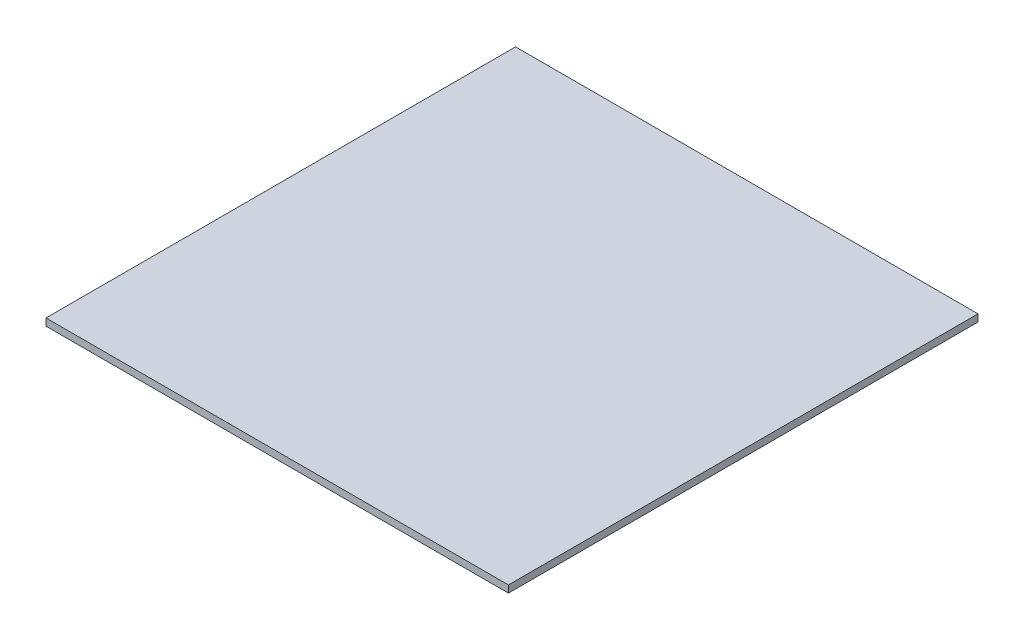
ISO-10303-21;
HEADER;
FILE_DESCRIPTION(('STEP AP214'),'2;1');
FILE_NAME('part.step','',(''),(''),'','','');
FILE_SCHEMA(('AUTOMOTIVE_DESIGN { 1 0 10303 214 1 1 1 1 }'));
ENDSEC;
DATA;
#1=APPLICATION_CONTEXT('core data for automotive mechanical design processes');
#2=APPLICATION_PROTOCOL_DEFINITION('international standard','automotive_design',2000,#1);
#3=PRODUCT_CONTEXT('',#1,'mechanical');
#4=PRODUCT('Part','Part','',(#3));
#5=PRODUCT_RELATED_PRODUCT_CATEGORY('part','',(#4));
#6=PRODUCT_DEFINITION_FORMATION('','',#4);
#7=PRODUCT_DEFINITION_CONTEXT('part definition',#1,'design');
#8=PRODUCT_DEFINITION('design','',#6,#7);
#9=PRODUCT_DEFINITION_SHAPE('','',#8);
#10=(LENGTH_UNIT() NAMED_UNIT(*) SI_UNIT(.MILLI.,.METRE.));
#11=(NAMED_UNIT(*) PLANE_ANGLE_UNIT() SI_UNIT($,.RADIAN.));
#12=(NAMED_UNIT(*) SI_UNIT($,.STERADIAN.) SOLID_ANGLE_UNIT());
#13=UNCERTAINTY_MEASURE_WITH_UNIT(LENGTH_MEASURE(1.E-05),#10,'distance_accuracy_value','');
#14=(GEOMETRIC_REPRESENTATION_CONTEXT(3) GLOBAL_UNCERTAINTY_ASSIGNED_CONTEXT((#13)) GLOBAL_UNIT_ASSIGNED_CONTEXT((#10,
#11,#12)) REPRESENTATION_CONTEXT('',''));
#15=CARTESIAN_POINT('',(0.,0.,0.));
#16=DIRECTION('',(0.,0.,1.));
#17=DIRECTION('',(1.,0.,0.));
#18=AXIS2_PLACEMENT_3D('',#15,#16,#17);
#19=CARTESIAN_POINT('',(103.1875,3.175,104.775));
#20=DIRECTION('',(-1.,0.,0.));
#21=DIRECTION('',(0.,0.,1.));
#22=AXIS2_PLACEMENT_3D('',#19,#20,#21);
#23=PLANE('',#22);
#24=DIRECTION('',(0.,0.,-1.));
#25=VECTOR('',#24,1.);
#26=CARTESIAN_POINT('',(103.1875,0.,104.775));
#27=LINE('',#26,#25);
#28=CARTESIAN_POINT('',(103.1875,0.,104.775));
#29=VERTEX_POINT('',#28);
#30=CARTESIAN_POINT('',(103.1875,0.,-104.775));
#31=VERTEX_POINT('',#30);
#32=EDGE_CURVE('E101',#29,#31,#27,.T.);
#33=ORIENTED_EDGE('',*,*,#32,.T.);
#34=DIRECTION('',(0.,-1.,0.));
#35=VECTOR('',#34,1.);
#36=CARTESIAN_POINT('',(103.1875,3.175,-104.775));
#37=LINE('',#36,#35);
#38=CARTESIAN_POINT('',(103.1875,3.175,-104.775));
#39=VERTEX_POINT('',#38);
#40=EDGE_CURVE('E11',#39,#31,#37,.T.);
#41=ORIENTED_EDGE('',*,*,#40,.F.);
#42=DIRECTION('',(0.,0.,-1.));
#43=VECTOR('',#42,1.);
#44=CARTESIAN_POINT('',(103.1875,3.175,104.775));
#45=LINE('',#44,#43);
#46=CARTESIAN_POINT('',(103.1875,3.175,104.775));
#47=VERTEX_POINT('',#46);
#48=EDGE_CURVE('E89',#47,#39,#45,.T.);
#49=ORIENTED_EDGE('',*,*,#48,.F.);
#50=DIRECTION('',(0.,-1.,0.));
#51=VECTOR('',#50,1.);
#52=CARTESIAN_POINT('',(103.1875,3.175,104.775));
#53=LINE('',#52,#51);
#54=EDGE_CURVE('E97',#47,#29,#53,.T.);
#55=ORIENTED_EDGE('',*,*,#54,.T.);
#56=EDGE_LOOP('',(#33,#41,#49,#55));
#57=FACE_BOUND('',#56,.T.);
#58=ADVANCED_FACE('F38',(#57),#23,.F.);
#59=CARTESIAN_POINT('',(-103.1875,3.175,-104.775));
#60=DIRECTION('',(0.,0.,1.));
#61=DIRECTION('',(1.,0.,0.));
#62=AXIS2_PLACEMENT_3D('',#59,#60,#61);
#63=PLANE('',#62);
#64=DIRECTION('',(-1.,0.,0.));
#65=VECTOR('',#64,1.);
#66=CARTESIAN_POINT('',(-103.1875,0.,-104.775));
#67=LINE('',#66,#65);
#68=CARTESIAN_POINT('',(-103.1875,0.,-104.775));
#69=VERTEX_POINT('',#68);
#70=EDGE_CURVE('E93',#31,#69,#67,.T.);
#71=ORIENTED_EDGE('',*,*,#70,.T.);
#72=DIRECTION('',(0.,-1.,0.));
#73=VECTOR('',#72,1.);
#74=CARTESIAN_POINT('',(-103.1875,3.175,-104.775));
#75=LINE('',#74,#73);
#76=CARTESIAN_POINT('',(-103.1875,3.175,-104.775));
#77=VERTEX_POINT('',#76);
#78=EDGE_CURVE('E46',#77,#69,#75,.T.);
#79=ORIENTED_EDGE('',*,*,#78,.F.);
#80=DIRECTION('',(-1.,0.,0.));
#81=VECTOR('',#80,1.);
#82=CARTESIAN_POINT('',(-103.1875,3.175,-104.775));
#83=LINE('',#82,#81);
#84=EDGE_CURVE('E84',#39,#77,#83,.T.);
#85=ORIENTED_EDGE('',*,*,#84,.F.);
#86=ORIENTED_EDGE('',*,*,#40,.T.);
#87=EDGE_LOOP('',(#71,#79,#85,#86));
#88=FACE_BOUND('',#87,.T.);
#89=ADVANCED_FACE('F92',(#88),#63,.F.);
#90=CARTESIAN_POINT('',(-103.1875,3.175,104.775));
#91=DIRECTION('',(1.,0.,0.));
#92=DIRECTION('',(0.,0.,-1.));
#93=AXIS2_PLACEMENT_3D('',#90,#91,#92);
#94=PLANE('',#93);
#95=DIRECTION('',(0.,0.,1.));
#96=VECTOR('',#95,1.);
#97=CARTESIAN_POINT('',(-103.1875,0.,104.775));
#98=LINE('',#97,#96);
#99=CARTESIAN_POINT('',(-103.1875,0.,104.775));
#100=VERTEX_POINT('',#99);
#101=EDGE_CURVE('E71',#69,#100,#98,.T.);
#102=ORIENTED_EDGE('',*,*,#101,.T.);
#103=DIRECTION('',(0.,-1.,0.));
#104=VECTOR('',#103,1.);
#105=CARTESIAN_POINT('',(-103.1875,3.175,104.775));
#106=LINE('',#105,#104);
#107=CARTESIAN_POINT('',(-103.1875,3.175,104.775));
#108=VERTEX_POINT('',#107);
#109=EDGE_CURVE('E94',#108,#100,#106,.T.);
#110=ORIENTED_EDGE('',*,*,#109,.F.);
#111=DIRECTION('',(0.,0.,1.));
#112=VECTOR('',#111,1.);
#113=CARTESIAN_POINT('',(-103.1875,3.175,104.775));
#114=LINE('',#113,#112);
#115=EDGE_CURVE('E87',#77,#108,#114,.T.);
#116=ORIENTED_EDGE('',*,*,#115,.F.);
#117=ORIENTED_EDGE('',*,*,#78,.T.);
#118=EDGE_LOOP('',(#102,#110,#116,#117));
#119=FACE_BOUND('',#118,.T.);
#120=ADVANCED_FACE('F95',(#119),#94,.F.);
#121=CARTESIAN_POINT('',(-103.1875,3.175,104.775));
#122=DIRECTION('',(0.,0.,-1.));
#123=DIRECTION('',(-1.,0.,0.));
#124=AXIS2_PLACEMENT_3D('',#121,#122,#123);
#125=PLANE('',#124);
#126=DIRECTION('',(1.,0.,0.));
#127=VECTOR('',#126,1.);
#128=CARTESIAN_POINT('',(-103.1875,0.,104.775));
#129=LINE('',#128,#127);
#130=EDGE_CURVE('E77',#100,#29,#129,.T.);
#131=ORIENTED_EDGE('',*,*,#130,.T.);
#132=ORIENTED_EDGE('',*,*,#54,.F.);
#133=DIRECTION('',(1.,0.,0.));
#134=VECTOR('',#133,1.);
#135=CARTESIAN_POINT('',(-103.1875,3.175,104.775));
#136=LINE('',#135,#134);
#137=EDGE_CURVE('E54',#108,#47,#136,.T.);
#138=ORIENTED_EDGE('',*,*,#137,.F.);
#139=ORIENTED_EDGE('',*,*,#109,.T.);
#140=EDGE_LOOP('',(#131,#132,#138,#139));
#141=FACE_BOUND('',#140,.T.);
#142=ADVANCED_FACE('F108',(#141),#125,.F.);
#143=CARTESIAN_POINT('',(0.,3.175,0.));
#144=DIRECTION('',(0.,-1.,0.));
#145=DIRECTION('',(0.,0.,-1.));
#146=AXIS2_PLACEMENT_3D('',#143,#144,#145);
#147=PLANE('',#146);
#148=ORIENTED_EDGE('',*,*,#48,.T.);
#149=ORIENTED_EDGE('',*,*,#84,.T.);
#150=ORIENTED_EDGE('',*,*,#115,.T.);
#151=ORIENTED_EDGE('',*,*,#137,.T.);
#152=EDGE_LOOP('',(#148,#149,#150,#151));
#153=FACE_BOUND('',#152,.T.);
#154=ADVANCED_FACE('F85',(#153),#147,.F.);
#155=CARTESIAN_POINT('',(0.,0.,0.));
#156=DIRECTION('',(0.,-1.,0.));
#157=DIRECTION('',(0.,0.,-1.));
#158=AXIS2_PLACEMENT_3D('',#155,#156,#157);
#159=PLANE('',#158);
#160=ORIENTED_EDGE('',*,*,#32,.F.);
#161=ORIENTED_EDGE('',*,*,#130,.F.);
#162=ORIENTED_EDGE('',*,*,#101,.F.);
#163=ORIENTED_EDGE('',*,*,#70,.F.);
#164=EDGE_LOOP('',(#160,#161,#162,#163));
#165=FACE_BOUND('',#164,.T.);
#166=ADVANCED_FACE('F111',(#165),#159,.T.);
#167=CLOSED_SHELL('',(#58,#89,#120,#142,#154,#166));
#168=MANIFOLD_SOLID_BREP('B2',#167);
#169=ADVANCED_BREP_SHAPE_REPRESENTATION('',(#18,#168),#14);
#170=SHAPE_DEFINITION_REPRESENTATION(#9,#169);
ENDSEC;
END-ISO-10303-21;
